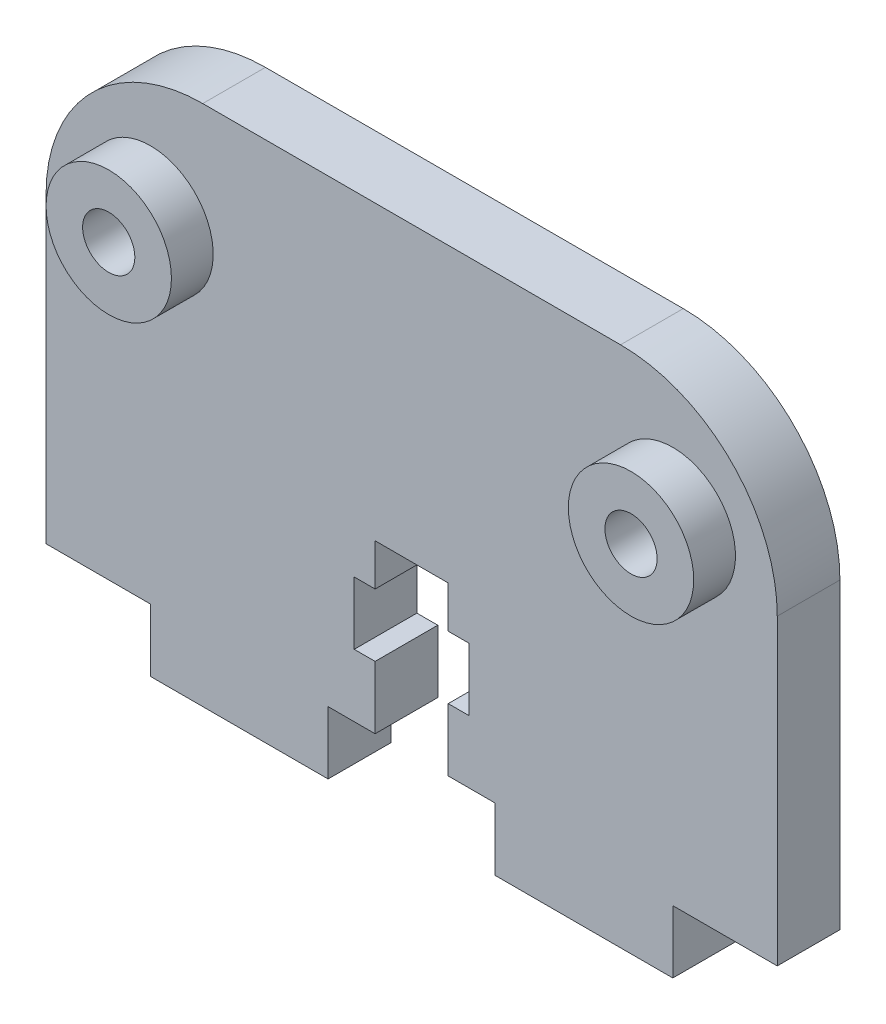
ISO-10303-21;
HEADER;
FILE_DESCRIPTION(('STEP AP214'),'2;1');
FILE_NAME('part.step','',(''),(''),'','','');
FILE_SCHEMA(('AUTOMOTIVE_DESIGN { 1 0 10303 214 1 1 1 1 }'));
ENDSEC;
DATA;
#1=APPLICATION_CONTEXT('core data for automotive mechanical design processes');
#2=APPLICATION_PROTOCOL_DEFINITION('international standard','automotive_design',2000,#1);
#3=PRODUCT_CONTEXT('',#1,'mechanical');
#4=PRODUCT('Part','Part','',(#3));
#5=PRODUCT_RELATED_PRODUCT_CATEGORY('part','',(#4));
#6=PRODUCT_DEFINITION_FORMATION('','',#4);
#7=PRODUCT_DEFINITION_CONTEXT('part definition',#1,'design');
#8=PRODUCT_DEFINITION('design','',#6,#7);
#9=PRODUCT_DEFINITION_SHAPE('','',#8);
#10=(LENGTH_UNIT() NAMED_UNIT(*) SI_UNIT(.MILLI.,.METRE.));
#11=(NAMED_UNIT(*) PLANE_ANGLE_UNIT() SI_UNIT($,.RADIAN.));
#12=(NAMED_UNIT(*) SI_UNIT($,.STERADIAN.) SOLID_ANGLE_UNIT());
#13=UNCERTAINTY_MEASURE_WITH_UNIT(LENGTH_MEASURE(1.E-05),#10,'distance_accuracy_value','');
#14=(GEOMETRIC_REPRESENTATION_CONTEXT(3) GLOBAL_UNCERTAINTY_ASSIGNED_CONTEXT((#13)) GLOBAL_UNIT_ASSIGNED_CONTEXT((#10,
#11,#12)) REPRESENTATION_CONTEXT('',''));
#15=CARTESIAN_POINT('',(0.,0.,0.));
#16=DIRECTION('',(0.,0.,1.));
#17=DIRECTION('',(1.,0.,0.));
#18=AXIS2_PLACEMENT_3D('',#15,#16,#17);
#19=CARTESIAN_POINT('',(0.,0.,3.));
#20=DIRECTION('',(0.,0.,-1.));
#21=DIRECTION('',(-1.,0.,0.));
#22=AXIS2_PLACEMENT_3D('',#19,#20,#21);
#23=PLANE('',#22);
#24=CARTESIAN_POINT('',(5.,19.,3.));
#25=DIRECTION('',(0.,0.,-1.));
#26=DIRECTION('',(-1.,0.,0.));
#27=AXIS2_PLACEMENT_3D('',#24,#25,#26);
#28=CIRCLE('',#27,3.);
#29=CARTESIAN_POINT('',(2.,19.,3.));
#30=VERTEX_POINT('',#29);
#31=EDGE_CURVE('E11',#30,#30,#28,.F.);
#32=ORIENTED_EDGE('',*,*,#31,.F.);
#33=EDGE_LOOP('',(#32));
#34=FACE_BOUND('',#33,.T.);
#35=CARTESIAN_POINT('',(30.,19.,3.));
#36=DIRECTION('',(0.,0.,-1.));
#37=DIRECTION('',(-1.,0.,0.));
#38=AXIS2_PLACEMENT_3D('',#35,#36,#37);
#39=CIRCLE('',#38,3.);
#40=CARTESIAN_POINT('',(27.,19.,3.));
#41=VERTEX_POINT('',#40);
#42=EDGE_CURVE('E45',#41,#41,#39,.F.);
#43=ORIENTED_EDGE('',*,*,#42,.F.);
#44=EDGE_LOOP('',(#43));
#45=FACE_BOUND('',#44,.T.);
#46=DIRECTION('',(0.,1.,0.));
#47=VECTOR('',#46,1.);
#48=CARTESIAN_POINT('',(30.,0.,3.));
#49=LINE('',#48,#47);
#50=CARTESIAN_POINT('',(30.,0.,3.));
#51=VERTEX_POINT('',#50);
#52=CARTESIAN_POINT('',(30.,3.,3.));
#53=VERTEX_POINT('',#52);
#54=EDGE_CURVE('E215',#51,#53,#49,.T.);
#55=ORIENTED_EDGE('',*,*,#54,.T.);
#56=DIRECTION('',(-1.,0.,0.));
#57=VECTOR('',#56,1.);
#58=CARTESIAN_POINT('',(35.,3.,3.));
#59=LINE('',#58,#57);
#60=CARTESIAN_POINT('',(35.,3.,3.));
#61=VERTEX_POINT('',#60);
#62=EDGE_CURVE('E228',#61,#53,#59,.T.);
#63=ORIENTED_EDGE('',*,*,#62,.F.);
#64=DIRECTION('',(0.,1.,0.));
#65=VECTOR('',#64,1.);
#66=CARTESIAN_POINT('',(35.,0.,3.));
#67=LINE('',#66,#65);
#68=CARTESIAN_POINT('',(35.,17.5,3.));
#69=VERTEX_POINT('',#68);
#70=EDGE_CURVE('E418',#61,#69,#67,.T.);
#71=ORIENTED_EDGE('',*,*,#70,.T.);
#72=CARTESIAN_POINT('',(27.5,17.5,3.));
#73=DIRECTION('',(0.,0.,-1.));
#74=DIRECTION('',(-1.,0.,0.));
#75=AXIS2_PLACEMENT_3D('',#72,#73,#74);
#76=CIRCLE('',#75,7.5);
#77=CARTESIAN_POINT('',(27.5,25.,3.));
#78=VERTEX_POINT('',#77);
#79=EDGE_CURVE('E264',#69,#78,#76,.F.);
#80=ORIENTED_EDGE('',*,*,#79,.T.);
#81=DIRECTION('',(-1.,0.,0.));
#82=VECTOR('',#81,1.);
#83=CARTESIAN_POINT('',(0.,25.,3.));
#84=LINE('',#83,#82);
#85=CARTESIAN_POINT('',(7.5,25.,3.));
#86=VERTEX_POINT('',#85);
#87=EDGE_CURVE('E251',#78,#86,#84,.T.);
#88=ORIENTED_EDGE('',*,*,#87,.T.);
#89=CARTESIAN_POINT('',(7.5,17.5,3.));
#90=DIRECTION('',(0.,0.,-1.));
#91=DIRECTION('',(-1.,0.,0.));
#92=AXIS2_PLACEMENT_3D('',#89,#90,#91);
#93=CIRCLE('',#92,7.5);
#94=CARTESIAN_POINT('',(0.,17.5,3.));
#95=VERTEX_POINT('',#94);
#96=EDGE_CURVE('E262',#86,#95,#93,.F.);
#97=ORIENTED_EDGE('',*,*,#96,.T.);
#98=DIRECTION('',(0.,-1.,0.));
#99=VECTOR('',#98,1.);
#100=CARTESIAN_POINT('',(0.,0.,3.));
#101=LINE('',#100,#99);
#102=CARTESIAN_POINT('',(0.,3.,3.));
#103=VERTEX_POINT('',#102);
#104=EDGE_CURVE('E247',#95,#103,#101,.T.);
#105=ORIENTED_EDGE('',*,*,#104,.T.);
#106=DIRECTION('',(-1.,0.,0.));
#107=VECTOR('',#106,1.);
#108=CARTESIAN_POINT('',(0.,3.,3.));
#109=LINE('',#108,#107);
#110=CARTESIAN_POINT('',(5.,3.,3.));
#111=VERTEX_POINT('',#110);
#112=EDGE_CURVE('E60',#111,#103,#109,.T.);
#113=ORIENTED_EDGE('',*,*,#112,.F.);
#114=DIRECTION('',(0.,1.,0.));
#115=VECTOR('',#114,1.);
#116=CARTESIAN_POINT('',(5.,0.,3.));
#117=LINE('',#116,#115);
#118=CARTESIAN_POINT('',(5.,0.,3.));
#119=VERTEX_POINT('',#118);
#120=EDGE_CURVE('E295',#119,#111,#117,.T.);
#121=ORIENTED_EDGE('',*,*,#120,.F.);
#122=DIRECTION('',(1.,0.,0.));
#123=VECTOR('',#122,1.);
#124=CARTESIAN_POINT('',(0.,0.,3.));
#125=LINE('',#124,#123);
#126=CARTESIAN_POINT('',(13.5,0.,3.));
#127=VERTEX_POINT('',#126);
#128=EDGE_CURVE('E416',#119,#127,#125,.T.);
#129=ORIENTED_EDGE('',*,*,#128,.T.);
#130=DIRECTION('',(0.,1.,0.));
#131=VECTOR('',#130,1.);
#132=CARTESIAN_POINT('',(13.5,0.,3.));
#133=LINE('',#132,#131);
#134=CARTESIAN_POINT('',(13.5,3.,3.));
#135=VERTEX_POINT('',#134);
#136=EDGE_CURVE('E396',#127,#135,#133,.T.);
#137=ORIENTED_EDGE('',*,*,#136,.T.);
#138=DIRECTION('',(1.,0.,0.));
#139=VECTOR('',#138,1.);
#140=CARTESIAN_POINT('',(13.5,3.,3.));
#141=LINE('',#140,#139);
#142=CARTESIAN_POINT('',(15.75,3.,3.));
#143=VERTEX_POINT('',#142);
#144=EDGE_CURVE('E400',#135,#143,#141,.T.);
#145=ORIENTED_EDGE('',*,*,#144,.T.);
#146=DIRECTION('',(0.,-1.,0.));
#147=VECTOR('',#146,1.);
#148=CARTESIAN_POINT('',(15.75,11.,3.));
#149=LINE('',#148,#147);
#150=CARTESIAN_POINT('',(15.75,6.,3.));
#151=VERTEX_POINT('',#150);
#152=EDGE_CURVE('E320',#151,#143,#149,.T.);
#153=ORIENTED_EDGE('',*,*,#152,.F.);
#154=DIRECTION('',(1.,0.,0.));
#155=VECTOR('',#154,1.);
#156=CARTESIAN_POINT('',(14.75,6.,3.));
#157=LINE('',#156,#155);
#158=CARTESIAN_POINT('',(14.75,6.,3.));
#159=VERTEX_POINT('',#158);
#160=EDGE_CURVE('E363',#159,#151,#157,.T.);
#161=ORIENTED_EDGE('',*,*,#160,.F.);
#162=DIRECTION('',(0.,-1.,0.));
#163=VECTOR('',#162,1.);
#164=CARTESIAN_POINT('',(14.75,9.,3.));
#165=LINE('',#164,#163);
#166=CARTESIAN_POINT('',(14.75,9.,3.));
#167=VERTEX_POINT('',#166);
#168=EDGE_CURVE('E360',#167,#159,#165,.T.);
#169=ORIENTED_EDGE('',*,*,#168,.F.);
#170=DIRECTION('',(-1.,0.,0.));
#171=VECTOR('',#170,1.);
#172=CARTESIAN_POINT('',(14.75,9.,3.));
#173=LINE('',#172,#171);
#174=CARTESIAN_POINT('',(15.75,9.,3.));
#175=VERTEX_POINT('',#174);
#176=EDGE_CURVE('E369',#175,#167,#173,.T.);
#177=ORIENTED_EDGE('',*,*,#176,.F.);
#178=DIRECTION('',(0.,-1.,0.));
#179=VECTOR('',#178,1.);
#180=CARTESIAN_POINT('',(15.75,11.,3.));
#181=LINE('',#180,#179);
#182=CARTESIAN_POINT('',(15.75,11.,3.));
#183=VERTEX_POINT('',#182);
#184=EDGE_CURVE('E333',#183,#175,#181,.T.);
#185=ORIENTED_EDGE('',*,*,#184,.F.);
#186=DIRECTION('',(1.,0.,0.));
#187=VECTOR('',#186,1.);
#188=CARTESIAN_POINT('',(15.75,11.,3.));
#189=LINE('',#188,#187);
#190=CARTESIAN_POINT('',(19.25,11.,3.));
#191=VERTEX_POINT('',#190);
#192=EDGE_CURVE('E302',#183,#191,#189,.T.);
#193=ORIENTED_EDGE('',*,*,#192,.T.);
#194=DIRECTION('',(0.,-1.,0.));
#195=VECTOR('',#194,1.);
#196=CARTESIAN_POINT('',(19.25,11.,3.));
#197=LINE('',#196,#195);
#198=CARTESIAN_POINT('',(19.25,9.,3.));
#199=VERTEX_POINT('',#198);
#200=EDGE_CURVE('E337',#191,#199,#197,.T.);
#201=ORIENTED_EDGE('',*,*,#200,.T.);
#202=CARTESIAN_POINT('',(20.25,9.,3.));
#203=VERTEX_POINT('',#202);
#204=EDGE_CURVE('E370',#203,#199,#173,.T.);
#205=ORIENTED_EDGE('',*,*,#204,.F.);
#206=DIRECTION('',(0.,1.,0.));
#207=VECTOR('',#206,1.);
#208=CARTESIAN_POINT('',(20.25,9.,3.));
#209=LINE('',#208,#207);
#210=CARTESIAN_POINT('',(20.25,6.,3.));
#211=VERTEX_POINT('',#210);
#212=EDGE_CURVE('E366',#211,#203,#209,.T.);
#213=ORIENTED_EDGE('',*,*,#212,.F.);
#214=CARTESIAN_POINT('',(19.25,6.,3.));
#215=VERTEX_POINT('',#214);
#216=EDGE_CURVE('E362',#215,#211,#157,.T.);
#217=ORIENTED_EDGE('',*,*,#216,.F.);
#218=DIRECTION('',(0.,-1.,0.));
#219=VECTOR('',#218,1.);
#220=CARTESIAN_POINT('',(19.25,11.,3.));
#221=LINE('',#220,#219);
#222=CARTESIAN_POINT('',(19.25,3.,3.));
#223=VERTEX_POINT('',#222);
#224=EDGE_CURVE('E322',#215,#223,#221,.T.);
#225=ORIENTED_EDGE('',*,*,#224,.T.);
#226=CARTESIAN_POINT('',(21.5,3.,3.));
#227=VERTEX_POINT('',#226);
#228=EDGE_CURVE('E399',#223,#227,#141,.T.);
#229=ORIENTED_EDGE('',*,*,#228,.T.);
#230=DIRECTION('',(0.,1.,0.));
#231=VECTOR('',#230,1.);
#232=CARTESIAN_POINT('',(21.5,0.,3.));
#233=LINE('',#232,#231);
#234=CARTESIAN_POINT('',(21.5,0.,3.));
#235=VERTEX_POINT('',#234);
#236=EDGE_CURVE('E403',#235,#227,#233,.T.);
#237=ORIENTED_EDGE('',*,*,#236,.F.);
#238=EDGE_CURVE('E281',#235,#51,#125,.T.);
#239=ORIENTED_EDGE('',*,*,#238,.T.);
#240=EDGE_LOOP('',(#55,#63,#71,#80,#88,#97,#105,#113,#121,#129,#137,#145,#153,#161,#169,#177,
#185,#193,#201,#205,#213,#217,#225,#229,#237,#239));
#241=FACE_BOUND('',#240,.T.);
#242=ADVANCED_FACE('F37',(#34,#45,#241),#23,.F.);
#243=CARTESIAN_POINT('',(0.,0.,0.));
#244=DIRECTION('',(0.,0.,-1.));
#245=DIRECTION('',(-1.,0.,0.));
#246=AXIS2_PLACEMENT_3D('',#243,#244,#245);
#247=PLANE('',#246);
#248=CARTESIAN_POINT('',(30.,19.,0.));
#249=DIRECTION('',(0.,0.,-1.));
#250=DIRECTION('',(-1.,0.,0.));
#251=AXIS2_PLACEMENT_3D('',#248,#249,#250);
#252=CIRCLE('',#251,1.25);
#253=CARTESIAN_POINT('',(28.75,19.,0.));
#254=VERTEX_POINT('',#253);
#255=EDGE_CURVE('E807',#254,#254,#252,.F.);
#256=ORIENTED_EDGE('',*,*,#255,.T.);
#257=EDGE_LOOP('',(#256));
#258=FACE_BOUND('',#257,.T.);
#259=CARTESIAN_POINT('',(5.,19.,0.));
#260=DIRECTION('',(0.,0.,-1.));
#261=DIRECTION('',(-1.,0.,0.));
#262=AXIS2_PLACEMENT_3D('',#259,#260,#261);
#263=CIRCLE('',#262,1.25);
#264=CARTESIAN_POINT('',(3.75,19.,0.));
#265=VERTEX_POINT('',#264);
#266=EDGE_CURVE('E802',#265,#265,#263,.F.);
#267=ORIENTED_EDGE('',*,*,#266,.T.);
#268=EDGE_LOOP('',(#267));
#269=FACE_BOUND('',#268,.T.);
#270=DIRECTION('',(-1.,0.,0.));
#271=VECTOR('',#270,1.);
#272=CARTESIAN_POINT('',(35.,3.,0.));
#273=LINE('',#272,#271);
#274=CARTESIAN_POINT('',(35.,3.,0.));
#275=VERTEX_POINT('',#274);
#276=CARTESIAN_POINT('',(30.,3.,0.));
#277=VERTEX_POINT('',#276);
#278=EDGE_CURVE('E52',#275,#277,#273,.T.);
#279=ORIENTED_EDGE('',*,*,#278,.T.);
#280=DIRECTION('',(0.,1.,0.));
#281=VECTOR('',#280,1.);
#282=CARTESIAN_POINT('',(30.,0.,0.));
#283=LINE('',#282,#281);
#284=CARTESIAN_POINT('',(30.,0.,0.));
#285=VERTEX_POINT('',#284);
#286=EDGE_CURVE('E213',#285,#277,#283,.T.);
#287=ORIENTED_EDGE('',*,*,#286,.F.);
#288=DIRECTION('',(1.,0.,0.));
#289=VECTOR('',#288,1.);
#290=CARTESIAN_POINT('',(0.,0.,0.));
#291=LINE('',#290,#289);
#292=CARTESIAN_POINT('',(21.5,0.,0.));
#293=VERTEX_POINT('',#292);
#294=EDGE_CURVE('E226',#293,#285,#291,.T.);
#295=ORIENTED_EDGE('',*,*,#294,.F.);
#296=DIRECTION('',(0.,1.,0.));
#297=VECTOR('',#296,1.);
#298=CARTESIAN_POINT('',(21.5,0.,0.));
#299=LINE('',#298,#297);
#300=CARTESIAN_POINT('',(21.5,3.,0.));
#301=VERTEX_POINT('',#300);
#302=EDGE_CURVE('E388',#293,#301,#299,.T.);
#303=ORIENTED_EDGE('',*,*,#302,.T.);
#304=DIRECTION('',(1.,0.,0.));
#305=VECTOR('',#304,1.);
#306=CARTESIAN_POINT('',(13.5,3.,0.));
#307=LINE('',#306,#305);
#308=CARTESIAN_POINT('',(19.25,3.,0.));
#309=VERTEX_POINT('',#308);
#310=EDGE_CURVE('E390',#309,#301,#307,.T.);
#311=ORIENTED_EDGE('',*,*,#310,.F.);
#312=DIRECTION('',(0.,-1.,0.));
#313=VECTOR('',#312,1.);
#314=CARTESIAN_POINT('',(19.25,11.,0.));
#315=LINE('',#314,#313);
#316=CARTESIAN_POINT('',(19.25,6.,0.));
#317=VERTEX_POINT('',#316);
#318=EDGE_CURVE('E325',#317,#309,#315,.T.);
#319=ORIENTED_EDGE('',*,*,#318,.F.);
#320=DIRECTION('',(1.,0.,0.));
#321=VECTOR('',#320,1.);
#322=CARTESIAN_POINT('',(14.75,6.,0.));
#323=LINE('',#322,#321);
#324=CARTESIAN_POINT('',(20.25,6.,0.));
#325=VERTEX_POINT('',#324);
#326=EDGE_CURVE('E377',#317,#325,#323,.T.);
#327=ORIENTED_EDGE('',*,*,#326,.T.);
#328=DIRECTION('',(0.,1.,0.));
#329=VECTOR('',#328,1.);
#330=CARTESIAN_POINT('',(20.25,9.,0.));
#331=LINE('',#330,#329);
#332=CARTESIAN_POINT('',(20.25,9.,0.));
#333=VERTEX_POINT('',#332);
#334=EDGE_CURVE('E327',#325,#333,#331,.T.);
#335=ORIENTED_EDGE('',*,*,#334,.T.);
#336=DIRECTION('',(-1.,0.,0.));
#337=VECTOR('',#336,1.);
#338=CARTESIAN_POINT('',(14.75,9.,0.));
#339=LINE('',#338,#337);
#340=CARTESIAN_POINT('',(19.25,9.,0.));
#341=VERTEX_POINT('',#340);
#342=EDGE_CURVE('E354',#333,#341,#339,.T.);
#343=ORIENTED_EDGE('',*,*,#342,.T.);
#344=DIRECTION('',(0.,-1.,0.));
#345=VECTOR('',#344,1.);
#346=CARTESIAN_POINT('',(19.25,11.,0.));
#347=LINE('',#346,#345);
#348=CARTESIAN_POINT('',(19.25,11.,0.));
#349=VERTEX_POINT('',#348);
#350=EDGE_CURVE('E331',#349,#341,#347,.T.);
#351=ORIENTED_EDGE('',*,*,#350,.F.);
#352=DIRECTION('',(1.,0.,0.));
#353=VECTOR('',#352,1.);
#354=CARTESIAN_POINT('',(15.75,11.,0.));
#355=LINE('',#354,#353);
#356=CARTESIAN_POINT('',(15.75,11.,0.));
#357=VERTEX_POINT('',#356);
#358=EDGE_CURVE('E341',#357,#349,#355,.T.);
#359=ORIENTED_EDGE('',*,*,#358,.F.);
#360=DIRECTION('',(0.,-1.,0.));
#361=VECTOR('',#360,1.);
#362=CARTESIAN_POINT('',(15.75,11.,0.));
#363=LINE('',#362,#361);
#364=CARTESIAN_POINT('',(15.75,9.,0.));
#365=VERTEX_POINT('',#364);
#366=EDGE_CURVE('E328',#357,#365,#363,.T.);
#367=ORIENTED_EDGE('',*,*,#366,.T.);
#368=CARTESIAN_POINT('',(14.75,9.,0.));
#369=VERTEX_POINT('',#368);
#370=EDGE_CURVE('E353',#365,#369,#339,.T.);
#371=ORIENTED_EDGE('',*,*,#370,.T.);
#372=DIRECTION('',(0.,-1.,0.));
#373=VECTOR('',#372,1.);
#374=CARTESIAN_POINT('',(14.75,9.,0.));
#375=LINE('',#374,#373);
#376=CARTESIAN_POINT('',(14.75,6.,0.));
#377=VERTEX_POINT('',#376);
#378=EDGE_CURVE('E357',#369,#377,#375,.T.);
#379=ORIENTED_EDGE('',*,*,#378,.T.);
#380=CARTESIAN_POINT('',(15.75,6.,0.));
#381=VERTEX_POINT('',#380);
#382=EDGE_CURVE('E385',#377,#381,#323,.T.);
#383=ORIENTED_EDGE('',*,*,#382,.T.);
#384=DIRECTION('',(0.,-1.,0.));
#385=VECTOR('',#384,1.);
#386=CARTESIAN_POINT('',(15.75,11.,0.));
#387=LINE('',#386,#385);
#388=CARTESIAN_POINT('',(15.75,3.,0.));
#389=VERTEX_POINT('',#388);
#390=EDGE_CURVE('E317',#381,#389,#387,.T.);
#391=ORIENTED_EDGE('',*,*,#390,.T.);
#392=CARTESIAN_POINT('',(13.5,3.,0.));
#393=VERTEX_POINT('',#392);
#394=EDGE_CURVE('E391',#393,#389,#307,.T.);
#395=ORIENTED_EDGE('',*,*,#394,.F.);
#396=DIRECTION('',(0.,1.,0.));
#397=VECTOR('',#396,1.);
#398=CARTESIAN_POINT('',(13.5,0.,0.));
#399=LINE('',#398,#397);
#400=CARTESIAN_POINT('',(13.5,0.,0.));
#401=VERTEX_POINT('',#400);
#402=EDGE_CURVE('E394',#401,#393,#399,.T.);
#403=ORIENTED_EDGE('',*,*,#402,.F.);
#404=CARTESIAN_POINT('',(5.,0.,0.));
#405=VERTEX_POINT('',#404);
#406=EDGE_CURVE('E234',#405,#401,#291,.T.);
#407=ORIENTED_EDGE('',*,*,#406,.F.);
#408=DIRECTION('',(0.,1.,0.));
#409=VECTOR('',#408,1.);
#410=CARTESIAN_POINT('',(5.,0.,0.));
#411=LINE('',#410,#409);
#412=CARTESIAN_POINT('',(5.,3.,0.));
#413=VERTEX_POINT('',#412);
#414=EDGE_CURVE('E289',#405,#413,#411,.T.);
#415=ORIENTED_EDGE('',*,*,#414,.T.);
#416=DIRECTION('',(-1.,0.,0.));
#417=VECTOR('',#416,1.);
#418=CARTESIAN_POINT('',(0.,3.,0.));
#419=LINE('',#418,#417);
#420=CARTESIAN_POINT('',(0.,3.,0.));
#421=VERTEX_POINT('',#420);
#422=EDGE_CURVE('E292',#413,#421,#419,.T.);
#423=ORIENTED_EDGE('',*,*,#422,.T.);
#424=DIRECTION('',(0.,-1.,0.));
#425=VECTOR('',#424,1.);
#426=CARTESIAN_POINT('',(0.,0.,0.));
#427=LINE('',#426,#425);
#428=CARTESIAN_POINT('',(0.,17.5,0.));
#429=VERTEX_POINT('',#428);
#430=EDGE_CURVE('E235',#429,#421,#427,.T.);
#431=ORIENTED_EDGE('',*,*,#430,.F.);
#432=CARTESIAN_POINT('',(7.5,17.5,0.));
#433=DIRECTION('',(0.,0.,-1.));
#434=DIRECTION('',(-1.,0.,0.));
#435=AXIS2_PLACEMENT_3D('',#432,#433,#434);
#436=CIRCLE('',#435,7.5);
#437=CARTESIAN_POINT('',(7.5,25.,0.));
#438=VERTEX_POINT('',#437);
#439=EDGE_CURVE('E254',#429,#438,#436,.T.);
#440=ORIENTED_EDGE('',*,*,#439,.T.);
#441=DIRECTION('',(-1.,0.,0.));
#442=VECTOR('',#441,1.);
#443=CARTESIAN_POINT('',(0.,25.,0.));
#444=LINE('',#443,#442);
#445=CARTESIAN_POINT('',(27.5,25.,0.));
#446=VERTEX_POINT('',#445);
#447=EDGE_CURVE('E244',#446,#438,#444,.T.);
#448=ORIENTED_EDGE('',*,*,#447,.F.);
#449=CARTESIAN_POINT('',(27.5,17.5,0.));
#450=DIRECTION('',(0.,0.,-1.));
#451=DIRECTION('',(-1.,0.,0.));
#452=AXIS2_PLACEMENT_3D('',#449,#450,#451);
#453=CIRCLE('',#452,7.5);
#454=CARTESIAN_POINT('',(35.,17.5,0.));
#455=VERTEX_POINT('',#454);
#456=EDGE_CURVE('E256',#446,#455,#453,.T.);
#457=ORIENTED_EDGE('',*,*,#456,.T.);
#458=DIRECTION('',(0.,1.,0.));
#459=VECTOR('',#458,1.);
#460=CARTESIAN_POINT('',(35.,0.,0.));
#461=LINE('',#460,#459);
#462=EDGE_CURVE('E237',#275,#455,#461,.T.);
#463=ORIENTED_EDGE('',*,*,#462,.F.);
#464=EDGE_LOOP('',(#279,#287,#295,#303,#311,#319,#327,#335,#343,#351,#359,#367,#371,#379,#383,
#391,#395,#403,#407,#415,#423,#431,#440,#448,#457,#463));
#465=FACE_BOUND('',#464,.T.);
#466=ADVANCED_FACE('F224',(#258,#269,#465),#247,.T.);
#467=CARTESIAN_POINT('',(0.,0.,3.));
#468=DIRECTION('',(0.,1.,0.));
#469=DIRECTION('',(0.,0.,1.));
#470=AXIS2_PLACEMENT_3D('',#467,#468,#469);
#471=PLANE('',#470);
#472=DIRECTION('',(0.,0.,1.));
#473=VECTOR('',#472,1.);
#474=CARTESIAN_POINT('',(30.,0.,-0.00100000000000013));
#475=LINE('',#474,#473);
#476=EDGE_CURVE('E210',#285,#51,#475,.T.);
#477=ORIENTED_EDGE('',*,*,#476,.T.);
#478=ORIENTED_EDGE('',*,*,#238,.F.);
#479=DIRECTION('',(0.,0.,1.));
#480=VECTOR('',#479,1.);
#481=CARTESIAN_POINT('',(21.5,0.,-0.00100000000000013));
#482=LINE('',#481,#480);
#483=EDGE_CURVE('E233',#293,#235,#482,.T.);
#484=ORIENTED_EDGE('',*,*,#483,.F.);
#485=ORIENTED_EDGE('',*,*,#294,.T.);
#486=EDGE_LOOP('',(#477,#478,#484,#485));
#487=FACE_BOUND('',#486,.T.);
#488=ADVANCED_FACE('F232',(#487),#471,.F.);
#489=CARTESIAN_POINT('',(13.5,3.,-0.00100000000000013));
#490=DIRECTION('',(0.,-1.,0.));
#491=DIRECTION('',(1.,0.,0.));
#492=AXIS2_PLACEMENT_3D('',#489,#490,#491);
#493=PLANE('',#492);
#494=ORIENTED_EDGE('',*,*,#228,.F.);
#495=DIRECTION('',(0.,0.,1.));
#496=VECTOR('',#495,1.);
#497=CARTESIAN_POINT('',(19.25,3.,-0.00100000000000013));
#498=LINE('',#497,#496);
#499=EDGE_CURVE('E312',#309,#223,#498,.T.);
#500=ORIENTED_EDGE('',*,*,#499,.F.);
#501=ORIENTED_EDGE('',*,*,#310,.T.);
#502=DIRECTION('',(0.,0.,1.));
#503=VECTOR('',#502,1.);
#504=CARTESIAN_POINT('',(21.5,3.,-0.00100000000000013));
#505=LINE('',#504,#503);
#506=EDGE_CURVE('E410',#301,#227,#505,.T.);
#507=ORIENTED_EDGE('',*,*,#506,.T.);
#508=EDGE_LOOP('',(#494,#500,#501,#507));
#509=FACE_BOUND('',#508,.T.);
#510=ADVANCED_FACE('F503',(#509),#493,.T.);
#511=CARTESIAN_POINT('',(14.75,9.,-0.00100000000000013));
#512=DIRECTION('',(0.,1.,0.));
#513=DIRECTION('',(-1.,0.,0.));
#514=AXIS2_PLACEMENT_3D('',#511,#512,#513);
#515=PLANE('',#514);
#516=DIRECTION('',(0.,0.,-1.));
#517=VECTOR('',#516,1.);
#518=CARTESIAN_POINT('',(19.25,9.,-0.00100000000000013));
#519=LINE('',#518,#517);
#520=EDGE_CURVE('E335',#199,#341,#519,.T.);
#521=ORIENTED_EDGE('',*,*,#520,.T.);
#522=ORIENTED_EDGE('',*,*,#342,.F.);
#523=DIRECTION('',(0.,0.,1.));
#524=VECTOR('',#523,1.);
#525=CARTESIAN_POINT('',(20.25,9.,-0.00100000000000013));
#526=LINE('',#525,#524);
#527=EDGE_CURVE('E378',#333,#203,#526,.T.);
#528=ORIENTED_EDGE('',*,*,#527,.T.);
#529=ORIENTED_EDGE('',*,*,#204,.T.);
#530=EDGE_LOOP('',(#521,#522,#528,#529));
#531=FACE_BOUND('',#530,.T.);
#532=ADVANCED_FACE('F485',(#531),#515,.F.);
#533=CARTESIAN_POINT('',(14.75,6.,-0.00100000000000013));
#534=DIRECTION('',(0.,-1.,0.));
#535=DIRECTION('',(1.,0.,0.));
#536=AXIS2_PLACEMENT_3D('',#533,#534,#535);
#537=PLANE('',#536);
#538=DIRECTION('',(0.,0.,1.));
#539=VECTOR('',#538,1.);
#540=CARTESIAN_POINT('',(19.25,6.,-0.00100000000000013));
#541=LINE('',#540,#539);
#542=EDGE_CURVE('E306',#317,#215,#541,.T.);
#543=ORIENTED_EDGE('',*,*,#542,.T.);
#544=ORIENTED_EDGE('',*,*,#216,.T.);
#545=DIRECTION('',(0.,0.,1.));
#546=VECTOR('',#545,1.);
#547=CARTESIAN_POINT('',(20.25,6.,-0.00100000000000013));
#548=LINE('',#547,#546);
#549=EDGE_CURVE('E380',#325,#211,#548,.T.);
#550=ORIENTED_EDGE('',*,*,#549,.F.);
#551=ORIENTED_EDGE('',*,*,#326,.F.);
#552=EDGE_LOOP('',(#543,#544,#550,#551));
#553=FACE_BOUND('',#552,.T.);
#554=ADVANCED_FACE('F494',(#553),#537,.F.);
#555=ORIENTED_EDGE('',*,*,#128,.F.);
#556=DIRECTION('',(0.,0.,1.));
#557=VECTOR('',#556,1.);
#558=CARTESIAN_POINT('',(5.,0.,-0.00100000000000013));
#559=LINE('',#558,#557);
#560=EDGE_CURVE('E299',#405,#119,#559,.T.);
#561=ORIENTED_EDGE('',*,*,#560,.F.);
#562=ORIENTED_EDGE('',*,*,#406,.T.);
#563=DIRECTION('',(0.,0.,1.));
#564=VECTOR('',#563,1.);
#565=CARTESIAN_POINT('',(13.5,0.,-0.00100000000000013));
#566=LINE('',#565,#564);
#567=EDGE_CURVE('E406',#401,#127,#566,.T.);
#568=ORIENTED_EDGE('',*,*,#567,.T.);
#569=EDGE_LOOP('',(#555,#561,#562,#568));
#570=FACE_BOUND('',#569,.T.);
#571=ADVANCED_FACE('F443',(#570),#471,.F.);
#572=CARTESIAN_POINT('',(0.,0.,3.));
#573=DIRECTION('',(1.,0.,0.));
#574=DIRECTION('',(0.,0.,-1.));
#575=AXIS2_PLACEMENT_3D('',#572,#573,#574);
#576=PLANE('',#575);
#577=ORIENTED_EDGE('',*,*,#430,.T.);
#578=DIRECTION('',(0.,0.,1.));
#579=VECTOR('',#578,1.);
#580=CARTESIAN_POINT('',(0.,3.,-0.00100000000000013));
#581=LINE('',#580,#579);
#582=EDGE_CURVE('E300',#421,#103,#581,.T.);
#583=ORIENTED_EDGE('',*,*,#582,.T.);
#584=ORIENTED_EDGE('',*,*,#104,.F.);
#585=DIRECTION('',(0.,0.,-1.));
#586=VECTOR('',#585,1.);
#587=CARTESIAN_POINT('',(0.,17.5,3.));
#588=LINE('',#587,#586);
#589=EDGE_CURVE('E266',#95,#429,#588,.T.);
#590=ORIENTED_EDGE('',*,*,#589,.T.);
#591=EDGE_LOOP('',(#577,#583,#584,#590));
#592=FACE_BOUND('',#591,.T.);
#593=ADVANCED_FACE('F431',(#592),#576,.F.);
#594=CARTESIAN_POINT('',(35.,0.,3.));
#595=DIRECTION('',(-1.,0.,0.));
#596=DIRECTION('',(0.,0.,1.));
#597=AXIS2_PLACEMENT_3D('',#594,#595,#596);
#598=PLANE('',#597);
#599=ORIENTED_EDGE('',*,*,#70,.F.);
#600=DIRECTION('',(0.,0.,1.));
#601=VECTOR('',#600,1.);
#602=CARTESIAN_POINT('',(35.,3.,-0.00100000000000013));
#603=LINE('',#602,#601);
#604=EDGE_CURVE('E282',#275,#61,#603,.T.);
#605=ORIENTED_EDGE('',*,*,#604,.F.);
#606=ORIENTED_EDGE('',*,*,#462,.T.);
#607=DIRECTION('',(0.,0.,-1.));
#608=VECTOR('',#607,1.);
#609=CARTESIAN_POINT('',(35.,17.5,3.));
#610=LINE('',#609,#608);
#611=EDGE_CURVE('E259',#455,#69,#610,.F.);
#612=ORIENTED_EDGE('',*,*,#611,.T.);
#613=EDGE_LOOP('',(#599,#605,#606,#612));
#614=FACE_BOUND('',#613,.T.);
#615=ADVANCED_FACE('F525',(#614),#598,.F.);
#616=CARTESIAN_POINT('',(0.,25.,3.));
#617=DIRECTION('',(0.,-1.,0.));
#618=DIRECTION('',(0.,0.,-1.));
#619=AXIS2_PLACEMENT_3D('',#616,#617,#618);
#620=PLANE('',#619);
#621=ORIENTED_EDGE('',*,*,#87,.F.);
#622=DIRECTION('',(0.,0.,-1.));
#623=VECTOR('',#622,1.);
#624=CARTESIAN_POINT('',(27.5,25.,3.));
#625=LINE('',#624,#623);
#626=EDGE_CURVE('E250',#78,#446,#625,.T.);
#627=ORIENTED_EDGE('',*,*,#626,.T.);
#628=ORIENTED_EDGE('',*,*,#447,.T.);
#629=DIRECTION('',(0.,0.,-1.));
#630=VECTOR('',#629,1.);
#631=CARTESIAN_POINT('',(7.5,25.,3.));
#632=LINE('',#631,#630);
#633=EDGE_CURVE('E248',#438,#86,#632,.F.);
#634=ORIENTED_EDGE('',*,*,#633,.T.);
#635=EDGE_LOOP('',(#621,#627,#628,#634));
#636=FACE_BOUND('',#635,.T.);
#637=ADVANCED_FACE('F521',(#636),#620,.F.);
#638=CARTESIAN_POINT('',(27.5,17.5,3.));
#639=DIRECTION('',(0.,0.,-1.));
#640=DIRECTION('',(-1.,0.,0.));
#641=AXIS2_PLACEMENT_3D('',#638,#639,#640);
#642=CYLINDRICAL_SURFACE('',#641,7.5);
#643=ORIENTED_EDGE('',*,*,#79,.F.);
#644=ORIENTED_EDGE('',*,*,#611,.F.);
#645=ORIENTED_EDGE('',*,*,#456,.F.);
#646=ORIENTED_EDGE('',*,*,#626,.F.);
#647=EDGE_LOOP('',(#643,#644,#645,#646));
#648=FACE_BOUND('',#647,.T.);
#649=ADVANCED_FACE('F524',(#648),#642,.T.);
#650=CARTESIAN_POINT('',(7.5,17.5,3.));
#651=DIRECTION('',(0.,0.,-1.));
#652=DIRECTION('',(-1.,0.,0.));
#653=AXIS2_PLACEMENT_3D('',#650,#651,#652);
#654=CYLINDRICAL_SURFACE('',#653,7.5);
#655=ORIENTED_EDGE('',*,*,#96,.F.);
#656=ORIENTED_EDGE('',*,*,#633,.F.);
#657=ORIENTED_EDGE('',*,*,#439,.F.);
#658=ORIENTED_EDGE('',*,*,#589,.F.);
#659=EDGE_LOOP('',(#655,#656,#657,#658));
#660=FACE_BOUND('',#659,.T.);
#661=ADVANCED_FACE('F39',(#660),#654,.T.);
#662=CARTESIAN_POINT('',(13.5,0.,-0.00100000000000013));
#663=DIRECTION('',(1.,0.,0.));
#664=DIRECTION('',(0.,1.,0.));
#665=AXIS2_PLACEMENT_3D('',#662,#663,#664);
#666=PLANE('',#665);
#667=ORIENTED_EDGE('',*,*,#402,.T.);
#668=DIRECTION('',(0.,0.,1.));
#669=VECTOR('',#668,1.);
#670=CARTESIAN_POINT('',(13.5,3.,-0.00100000000000013));
#671=LINE('',#670,#669);
#672=EDGE_CURVE('E239',#393,#135,#671,.T.);
#673=ORIENTED_EDGE('',*,*,#672,.T.);
#674=ORIENTED_EDGE('',*,*,#136,.F.);
#675=ORIENTED_EDGE('',*,*,#567,.F.);
#676=EDGE_LOOP('',(#667,#673,#674,#675));
#677=FACE_BOUND('',#676,.T.);
#678=ADVANCED_FACE('F447',(#677),#666,.T.);
#679=DIRECTION('',(0.,0.,1.));
#680=VECTOR('',#679,1.);
#681=CARTESIAN_POINT('',(15.75,3.,-0.00100000000000013));
#682=LINE('',#681,#680);
#683=EDGE_CURVE('E314',#389,#143,#682,.T.);
#684=ORIENTED_EDGE('',*,*,#683,.T.);
#685=ORIENTED_EDGE('',*,*,#144,.F.);
#686=ORIENTED_EDGE('',*,*,#672,.F.);
#687=ORIENTED_EDGE('',*,*,#394,.T.);
#688=EDGE_LOOP('',(#684,#685,#686,#687));
#689=FACE_BOUND('',#688,.T.);
#690=ADVANCED_FACE('F451',(#689),#493,.T.);
#691=CARTESIAN_POINT('',(21.5,0.,-0.00100000000000013));
#692=DIRECTION('',(1.,0.,0.));
#693=DIRECTION('',(0.,0.,-1.));
#694=AXIS2_PLACEMENT_3D('',#691,#692,#693);
#695=PLANE('',#694);
#696=ORIENTED_EDGE('',*,*,#483,.T.);
#697=ORIENTED_EDGE('',*,*,#236,.T.);
#698=ORIENTED_EDGE('',*,*,#506,.F.);
#699=ORIENTED_EDGE('',*,*,#302,.F.);
#700=EDGE_LOOP('',(#696,#697,#698,#699));
#701=FACE_BOUND('',#700,.T.);
#702=ADVANCED_FACE('F505',(#701),#695,.F.);
#703=CARTESIAN_POINT('',(14.75,9.,-0.00100000000000013));
#704=DIRECTION('',(-1.,0.,0.));
#705=DIRECTION('',(0.,0.,1.));
#706=AXIS2_PLACEMENT_3D('',#703,#704,#705);
#707=PLANE('',#706);
#708=DIRECTION('',(0.,0.,1.));
#709=VECTOR('',#708,1.);
#710=CARTESIAN_POINT('',(14.75,9.,-0.00100000000000013));
#711=LINE('',#710,#709);
#712=EDGE_CURVE('E374',#369,#167,#711,.T.);
#713=ORIENTED_EDGE('',*,*,#712,.T.);
#714=ORIENTED_EDGE('',*,*,#168,.T.);
#715=DIRECTION('',(0.,0.,1.));
#716=VECTOR('',#715,1.);
#717=CARTESIAN_POINT('',(14.75,6.,-0.00100000000000013));
#718=LINE('',#717,#716);
#719=EDGE_CURVE('E373',#377,#159,#718,.T.);
#720=ORIENTED_EDGE('',*,*,#719,.F.);
#721=ORIENTED_EDGE('',*,*,#378,.F.);
#722=EDGE_LOOP('',(#713,#714,#720,#721));
#723=FACE_BOUND('',#722,.T.);
#724=ADVANCED_FACE('F463',(#723),#707,.F.);
#725=ORIENTED_EDGE('',*,*,#370,.F.);
#726=DIRECTION('',(0.,0.,-1.));
#727=VECTOR('',#726,1.);
#728=CARTESIAN_POINT('',(15.75,9.,-0.00100000000000013));
#729=LINE('',#728,#727);
#730=EDGE_CURVE('E310',#175,#365,#729,.T.);
#731=ORIENTED_EDGE('',*,*,#730,.F.);
#732=ORIENTED_EDGE('',*,*,#176,.T.);
#733=ORIENTED_EDGE('',*,*,#712,.F.);
#734=EDGE_LOOP('',(#725,#731,#732,#733));
#735=FACE_BOUND('',#734,.T.);
#736=ADVANCED_FACE('F470',(#735),#515,.F.);
#737=CARTESIAN_POINT('',(20.25,9.,-0.00100000000000013));
#738=DIRECTION('',(1.,0.,0.));
#739=DIRECTION('',(0.,1.,0.));
#740=AXIS2_PLACEMENT_3D('',#737,#738,#739);
#741=PLANE('',#740);
#742=ORIENTED_EDGE('',*,*,#549,.T.);
#743=ORIENTED_EDGE('',*,*,#212,.T.);
#744=ORIENTED_EDGE('',*,*,#527,.F.);
#745=ORIENTED_EDGE('',*,*,#334,.F.);
#746=EDGE_LOOP('',(#742,#743,#744,#745));
#747=FACE_BOUND('',#746,.T.);
#748=ADVANCED_FACE('F489',(#747),#741,.F.);
#749=ORIENTED_EDGE('',*,*,#160,.T.);
#750=DIRECTION('',(0.,0.,1.));
#751=VECTOR('',#750,1.);
#752=CARTESIAN_POINT('',(15.75,6.,-0.00100000000000013));
#753=LINE('',#752,#751);
#754=EDGE_CURVE('E309',#381,#151,#753,.T.);
#755=ORIENTED_EDGE('',*,*,#754,.F.);
#756=ORIENTED_EDGE('',*,*,#382,.F.);
#757=ORIENTED_EDGE('',*,*,#719,.T.);
#758=EDGE_LOOP('',(#749,#755,#756,#757));
#759=FACE_BOUND('',#758,.T.);
#760=ADVANCED_FACE('F459',(#759),#537,.F.);
#761=CARTESIAN_POINT('',(15.75,11.,-0.00100000000000013));
#762=DIRECTION('',(-1.,0.,0.));
#763=DIRECTION('',(0.,0.,1.));
#764=AXIS2_PLACEMENT_3D('',#761,#762,#763);
#765=PLANE('',#764);
#766=ORIENTED_EDGE('',*,*,#390,.F.);
#767=ORIENTED_EDGE('',*,*,#754,.T.);
#768=ORIENTED_EDGE('',*,*,#152,.T.);
#769=ORIENTED_EDGE('',*,*,#683,.F.);
#770=EDGE_LOOP('',(#766,#767,#768,#769));
#771=FACE_BOUND('',#770,.T.);
#772=ADVANCED_FACE('F556',(#771),#765,.F.);
#773=CARTESIAN_POINT('',(19.25,11.,-0.00100000000000013));
#774=DIRECTION('',(-1.,0.,0.));
#775=DIRECTION('',(0.,0.,1.));
#776=AXIS2_PLACEMENT_3D('',#773,#774,#775);
#777=PLANE('',#776);
#778=ORIENTED_EDGE('',*,*,#499,.T.);
#779=ORIENTED_EDGE('',*,*,#224,.F.);
#780=ORIENTED_EDGE('',*,*,#542,.F.);
#781=ORIENTED_EDGE('',*,*,#318,.T.);
#782=EDGE_LOOP('',(#778,#779,#780,#781));
#783=FACE_BOUND('',#782,.T.);
#784=ADVANCED_FACE('F498',(#783),#777,.T.);
#785=CARTESIAN_POINT('',(15.75,11.,-0.00100000000000013));
#786=DIRECTION('',(-1.,0.,0.));
#787=DIRECTION('',(0.,0.,1.));
#788=AXIS2_PLACEMENT_3D('',#785,#786,#787);
#789=PLANE('',#788);
#790=DIRECTION('',(0.,0.,1.));
#791=VECTOR('',#790,1.);
#792=CARTESIAN_POINT('',(15.75,11.,-0.00100000000000013));
#793=LINE('',#792,#791);
#794=EDGE_CURVE('E336',#357,#183,#793,.T.);
#795=ORIENTED_EDGE('',*,*,#794,.T.);
#796=ORIENTED_EDGE('',*,*,#184,.T.);
#797=ORIENTED_EDGE('',*,*,#730,.T.);
#798=ORIENTED_EDGE('',*,*,#366,.F.);
#799=EDGE_LOOP('',(#795,#796,#797,#798));
#800=FACE_BOUND('',#799,.T.);
#801=ADVANCED_FACE('F475',(#800),#789,.F.);
#802=CARTESIAN_POINT('',(19.25,11.,-0.00100000000000013));
#803=DIRECTION('',(-1.,0.,0.));
#804=DIRECTION('',(0.,0.,1.));
#805=AXIS2_PLACEMENT_3D('',#802,#803,#804);
#806=PLANE('',#805);
#807=ORIENTED_EDGE('',*,*,#350,.T.);
#808=ORIENTED_EDGE('',*,*,#520,.F.);
#809=ORIENTED_EDGE('',*,*,#200,.F.);
#810=DIRECTION('',(0.,0.,1.));
#811=VECTOR('',#810,1.);
#812=CARTESIAN_POINT('',(19.25,11.,-0.00100000000000013));
#813=LINE('',#812,#811);
#814=EDGE_CURVE('E332',#349,#191,#813,.T.);
#815=ORIENTED_EDGE('',*,*,#814,.F.);
#816=EDGE_LOOP('',(#807,#808,#809,#815));
#817=FACE_BOUND('',#816,.T.);
#818=ADVANCED_FACE('F481',(#817),#806,.T.);
#819=CARTESIAN_POINT('',(15.75,11.,-0.00100000000000013));
#820=DIRECTION('',(0.,-1.,0.));
#821=DIRECTION('',(0.,0.,-1.));
#822=AXIS2_PLACEMENT_3D('',#819,#820,#821);
#823=PLANE('',#822);
#824=ORIENTED_EDGE('',*,*,#358,.T.);
#825=ORIENTED_EDGE('',*,*,#814,.T.);
#826=ORIENTED_EDGE('',*,*,#192,.F.);
#827=ORIENTED_EDGE('',*,*,#794,.F.);
#828=EDGE_LOOP('',(#824,#825,#826,#827));
#829=FACE_BOUND('',#828,.T.);
#830=ADVANCED_FACE('F477',(#829),#823,.T.);
#831=CARTESIAN_POINT('',(0.,3.,-0.00100000000000013));
#832=DIRECTION('',(0.,1.,0.));
#833=DIRECTION('',(0.,0.,1.));
#834=AXIS2_PLACEMENT_3D('',#831,#832,#833);
#835=PLANE('',#834);
#836=DIRECTION('',(0.,0.,1.));
#837=VECTOR('',#836,1.);
#838=CARTESIAN_POINT('',(5.,3.,-0.00100000000000013));
#839=LINE('',#838,#837);
#840=EDGE_CURVE('E303',#413,#111,#839,.T.);
#841=ORIENTED_EDGE('',*,*,#840,.T.);
#842=ORIENTED_EDGE('',*,*,#112,.T.);
#843=ORIENTED_EDGE('',*,*,#582,.F.);
#844=ORIENTED_EDGE('',*,*,#422,.F.);
#845=EDGE_LOOP('',(#841,#842,#843,#844));
#846=FACE_BOUND('',#845,.T.);
#847=ADVANCED_FACE('F435',(#846),#835,.F.);
#848=CARTESIAN_POINT('',(5.,0.,-0.00100000000000013));
#849=DIRECTION('',(1.,0.,0.));
#850=DIRECTION('',(0.,0.,-1.));
#851=AXIS2_PLACEMENT_3D('',#848,#849,#850);
#852=PLANE('',#851);
#853=ORIENTED_EDGE('',*,*,#560,.T.);
#854=ORIENTED_EDGE('',*,*,#120,.T.);
#855=ORIENTED_EDGE('',*,*,#840,.F.);
#856=ORIENTED_EDGE('',*,*,#414,.F.);
#857=EDGE_LOOP('',(#853,#854,#855,#856));
#858=FACE_BOUND('',#857,.T.);
#859=ADVANCED_FACE('F437',(#858),#852,.F.);
#860=CARTESIAN_POINT('',(30.,0.,-0.00100000000000013));
#861=DIRECTION('',(1.,0.,0.));
#862=DIRECTION('',(0.,0.,-1.));
#863=AXIS2_PLACEMENT_3D('',#860,#861,#862);
#864=PLANE('',#863);
#865=ORIENTED_EDGE('',*,*,#286,.T.);
#866=DIRECTION('',(0.,0.,1.));
#867=VECTOR('',#866,1.);
#868=CARTESIAN_POINT('',(30.,3.,-0.00100000000000013));
#869=LINE('',#868,#867);
#870=EDGE_CURVE('E220',#277,#53,#869,.T.);
#871=ORIENTED_EDGE('',*,*,#870,.T.);
#872=ORIENTED_EDGE('',*,*,#54,.F.);
#873=ORIENTED_EDGE('',*,*,#476,.F.);
#874=EDGE_LOOP('',(#865,#871,#872,#873));
#875=FACE_BOUND('',#874,.T.);
#876=ADVANCED_FACE('F212',(#875),#864,.T.);
#877=CARTESIAN_POINT('',(35.,3.,-0.00100000000000013));
#878=DIRECTION('',(0.,1.,0.));
#879=DIRECTION('',(-1.,0.,0.));
#880=AXIS2_PLACEMENT_3D('',#877,#878,#879);
#881=PLANE('',#880);
#882=ORIENTED_EDGE('',*,*,#604,.T.);
#883=ORIENTED_EDGE('',*,*,#62,.T.);
#884=ORIENTED_EDGE('',*,*,#870,.F.);
#885=ORIENTED_EDGE('',*,*,#278,.F.);
#886=EDGE_LOOP('',(#882,#883,#884,#885));
#887=FACE_BOUND('',#886,.T.);
#888=ADVANCED_FACE('F538',(#887),#881,.F.);
#889=CARTESIAN_POINT('',(30.,19.,5.));
#890=DIRECTION('',(0.,0.,-1.));
#891=DIRECTION('',(-1.,0.,0.));
#892=AXIS2_PLACEMENT_3D('',#889,#890,#891);
#893=CYLINDRICAL_SURFACE('',#892,3.);
#894=CARTESIAN_POINT('',(30.,19.,5.));
#895=DIRECTION('',(0.,0.,1.));
#896=DIRECTION('',(1.,0.,0.));
#897=AXIS2_PLACEMENT_3D('',#894,#895,#896);
#898=CIRCLE('',#897,3.);
#899=CARTESIAN_POINT('',(33.,19.,5.));
#900=VERTEX_POINT('',#899);
#901=EDGE_CURVE('E229',#900,#900,#898,.T.);
#902=ORIENTED_EDGE('',*,*,#901,.F.);
#903=EDGE_LOOP('',(#902));
#904=FACE_BOUND('',#903,.T.);
#905=ORIENTED_EDGE('',*,*,#42,.T.);
#906=EDGE_LOOP('',(#905));
#907=FACE_BOUND('',#906,.T.);
#908=ADVANCED_FACE('F271',(#904,#907),#893,.T.);
#909=CARTESIAN_POINT('',(30.,19.,5.));
#910=DIRECTION('',(0.,0.,1.));
#911=DIRECTION('',(1.,0.,0.));
#912=AXIS2_PLACEMENT_3D('',#909,#910,#911);
#913=PLANE('',#912);
#914=CARTESIAN_POINT('',(30.,19.,5.));
#915=DIRECTION('',(0.,0.,1.));
#916=DIRECTION('',(1.,0.,0.));
#917=AXIS2_PLACEMENT_3D('',#914,#915,#916);
#918=CIRCLE('',#917,1.25);
#919=CARTESIAN_POINT('',(31.25,19.,5.));
#920=VERTEX_POINT('',#919);
#921=EDGE_CURVE('E793',#920,#920,#918,.T.);
#922=ORIENTED_EDGE('',*,*,#921,.F.);
#923=EDGE_LOOP('',(#922));
#924=FACE_BOUND('',#923,.T.);
#925=ORIENTED_EDGE('',*,*,#901,.T.);
#926=EDGE_LOOP('',(#925));
#927=FACE_BOUND('',#926,.T.);
#928=ADVANCED_FACE('F545',(#924,#927),#913,.T.);
#929=CARTESIAN_POINT('',(5.,19.,5.));
#930=DIRECTION('',(0.,0.,-1.));
#931=DIRECTION('',(-1.,0.,0.));
#932=AXIS2_PLACEMENT_3D('',#929,#930,#931);
#933=CYLINDRICAL_SURFACE('',#932,3.);
#934=CARTESIAN_POINT('',(5.,19.,5.));
#935=DIRECTION('',(0.,0.,1.));
#936=DIRECTION('',(1.,0.,0.));
#937=AXIS2_PLACEMENT_3D('',#934,#935,#936);
#938=CIRCLE('',#937,3.);
#939=CARTESIAN_POINT('',(8.,19.,5.));
#940=VERTEX_POINT('',#939);
#941=EDGE_CURVE('E796',#940,#940,#938,.T.);
#942=ORIENTED_EDGE('',*,*,#941,.F.);
#943=EDGE_LOOP('',(#942));
#944=FACE_BOUND('',#943,.T.);
#945=ORIENTED_EDGE('',*,*,#31,.T.);
#946=EDGE_LOOP('',(#945));
#947=FACE_BOUND('',#946,.T.);
#948=ADVANCED_FACE('F607',(#944,#947),#933,.T.);
#949=CARTESIAN_POINT('',(5.,19.,5.));
#950=DIRECTION('',(0.,0.,1.));
#951=DIRECTION('',(1.,0.,0.));
#952=AXIS2_PLACEMENT_3D('',#949,#950,#951);
#953=PLANE('',#952);
#954=CARTESIAN_POINT('',(5.,19.,5.));
#955=DIRECTION('',(0.,0.,1.));
#956=DIRECTION('',(1.,0.,0.));
#957=AXIS2_PLACEMENT_3D('',#954,#955,#956);
#958=CIRCLE('',#957,1.25);
#959=CARTESIAN_POINT('',(6.25,19.,5.));
#960=VERTEX_POINT('',#959);
#961=EDGE_CURVE('E799',#960,#960,#958,.T.);
#962=ORIENTED_EDGE('',*,*,#961,.F.);
#963=EDGE_LOOP('',(#962));
#964=FACE_BOUND('',#963,.T.);
#965=ORIENTED_EDGE('',*,*,#941,.T.);
#966=EDGE_LOOP('',(#965));
#967=FACE_BOUND('',#966,.T.);
#968=ADVANCED_FACE('F612',(#964,#967),#953,.T.);
#969=CARTESIAN_POINT('',(5.,19.,-0.00100000000000013));
#970=DIRECTION('',(0.,0.,1.));
#971=DIRECTION('',(1.,0.,0.));
#972=AXIS2_PLACEMENT_3D('',#969,#970,#971);
#973=CYLINDRICAL_SURFACE('',#972,1.25);
#974=ORIENTED_EDGE('',*,*,#266,.F.);
#975=EDGE_LOOP('',(#974));
#976=FACE_BOUND('',#975,.T.);
#977=ORIENTED_EDGE('',*,*,#961,.T.);
#978=EDGE_LOOP('',(#977));
#979=FACE_BOUND('',#978,.T.);
#980=ADVANCED_FACE('F623',(#976,#979),#973,.F.);
#981=CARTESIAN_POINT('',(30.,19.,-0.00100000000000013));
#982=DIRECTION('',(0.,0.,1.));
#983=DIRECTION('',(1.,0.,0.));
#984=AXIS2_PLACEMENT_3D('',#981,#982,#983);
#985=CYLINDRICAL_SURFACE('',#984,1.25);
#986=ORIENTED_EDGE('',*,*,#255,.F.);
#987=EDGE_LOOP('',(#986));
#988=FACE_BOUND('',#987,.T.);
#989=ORIENTED_EDGE('',*,*,#921,.T.);
#990=EDGE_LOOP('',(#989));
#991=FACE_BOUND('',#990,.T.);
#992=ADVANCED_FACE('F632',(#988,#991),#985,.F.);
#993=CLOSED_SHELL('',(#242,#466,#488,#510,#532,#554,#571,#593,#615,#637,#649,#661,#678,#690,
#702,#724,#736,#748,#760,#772,#784,#801,#818,#830,#847,#859,#876,#888,#908,#928,#948,#968,#980,#992));
#994=MANIFOLD_SOLID_BREP('B2',#993);
#995=ADVANCED_BREP_SHAPE_REPRESENTATION('',(#18,#994),#14);
#996=SHAPE_DEFINITION_REPRESENTATION(#9,#995);
ENDSEC;
END-ISO-10303-21;
